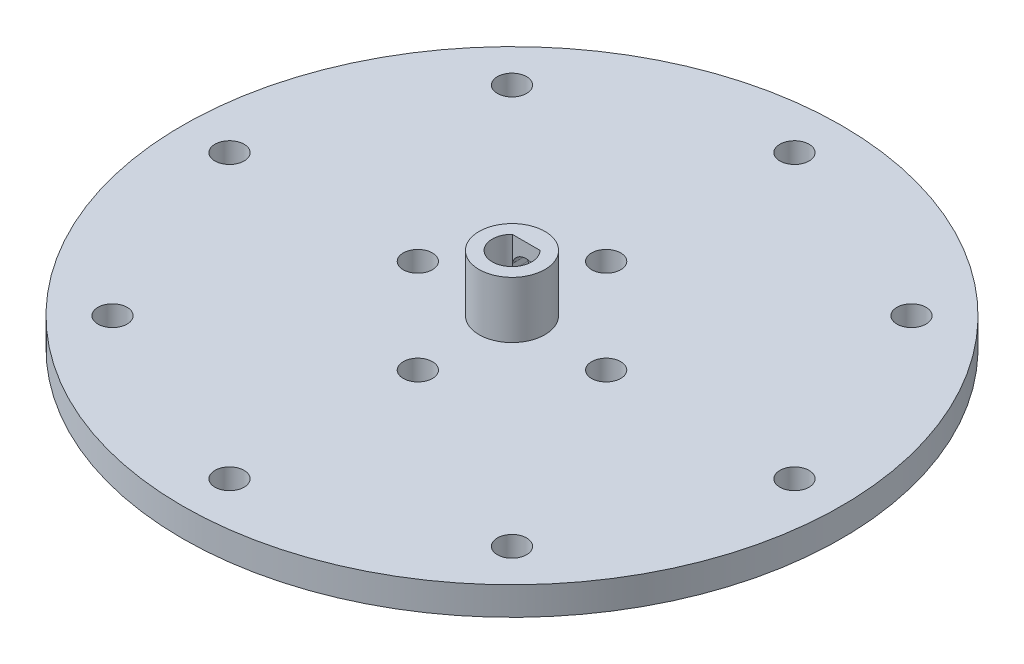
ISO-10303-21;
HEADER;
FILE_DESCRIPTION(('STEP AP214'),'2;1');
FILE_NAME('part.step','',(''),(''),'','','');
FILE_SCHEMA(('AUTOMOTIVE_DESIGN { 1 0 10303 214 1 1 1 1 }'));
ENDSEC;
DATA;
#1=APPLICATION_CONTEXT('core data for automotive mechanical design processes');
#2=APPLICATION_PROTOCOL_DEFINITION('international standard','automotive_design',2000,#1);
#3=PRODUCT_CONTEXT('',#1,'mechanical');
#4=PRODUCT('Part','Part','',(#3));
#5=PRODUCT_RELATED_PRODUCT_CATEGORY('part','',(#4));
#6=PRODUCT_DEFINITION_FORMATION('','',#4);
#7=PRODUCT_DEFINITION_CONTEXT('part definition',#1,'design');
#8=PRODUCT_DEFINITION('design','',#6,#7);
#9=PRODUCT_DEFINITION_SHAPE('','',#8);
#10=(LENGTH_UNIT() NAMED_UNIT(*) SI_UNIT(.MILLI.,.METRE.));
#11=(NAMED_UNIT(*) PLANE_ANGLE_UNIT() SI_UNIT($,.RADIAN.));
#12=(NAMED_UNIT(*) SI_UNIT($,.STERADIAN.) SOLID_ANGLE_UNIT());
#13=UNCERTAINTY_MEASURE_WITH_UNIT(LENGTH_MEASURE(1.E-05),#10,'distance_accuracy_value','');
#14=(GEOMETRIC_REPRESENTATION_CONTEXT(3) GLOBAL_UNCERTAINTY_ASSIGNED_CONTEXT((#13)) GLOBAL_UNIT_ASSIGNED_CONTEXT((#10,
#11,#12)) REPRESENTATION_CONTEXT('',''));
#15=CARTESIAN_POINT('',(0.,0.,0.));
#16=DIRECTION('',(0.,0.,1.));
#17=DIRECTION('',(1.,0.,0.));
#18=AXIS2_PLACEMENT_3D('',#15,#16,#17);
#19=CARTESIAN_POINT('',(0.,0.,-1.5));
#20=DIRECTION('',(0.,0.,1.));
#21=DIRECTION('',(1.,0.,0.));
#22=AXIS2_PLACEMENT_3D('',#19,#20,#21);
#23=PLANE('',#22);
#24=CARTESIAN_POINT('',(0.,6.,-1.5));
#25=DIRECTION('',(0.,0.,1.));
#26=DIRECTION('',(1.,0.,0.));
#27=AXIS2_PLACEMENT_3D('',#24,#25,#26);
#28=CIRCLE('',#27,1.5);
#29=CARTESIAN_POINT('',(-1.46969384566991,5.7,-1.5));
#30=VERTEX_POINT('',#29);
#31=CARTESIAN_POINT('',(1.46969384566991,5.7,-1.5));
#32=VERTEX_POINT('',#31);
#33=EDGE_CURVE('E124',#30,#32,#28,.T.);
#34=ORIENTED_EDGE('',*,*,#33,.F.);
#35=DIRECTION('',(0.,1.,0.));
#36=VECTOR('',#35,1.);
#37=CARTESIAN_POINT('',(-1.46969384566991,0.,-1.5));
#38=LINE('',#37,#36);
#39=CARTESIAN_POINT('',(-1.46969384566991,0.,-1.5));
#40=VERTEX_POINT('',#39);
#41=EDGE_CURVE('E134',#40,#30,#38,.T.);
#42=ORIENTED_EDGE('',*,*,#41,.F.);
#43=DIRECTION('',(1.,0.,0.));
#44=VECTOR('',#43,1.);
#45=CARTESIAN_POINT('',(0.,0.,-1.5));
#46=LINE('',#45,#44);
#47=CARTESIAN_POINT('',(1.46969384566991,0.,-1.5));
#48=VERTEX_POINT('',#47);
#49=EDGE_CURVE('E170',#40,#48,#46,.T.);
#50=ORIENTED_EDGE('',*,*,#49,.T.);
#51=DIRECTION('',(0.,1.,0.));
#52=VECTOR('',#51,1.);
#53=CARTESIAN_POINT('',(1.46969384566991,0.,-1.5));
#54=LINE('',#53,#52);
#55=EDGE_CURVE('E135',#48,#32,#54,.T.);
#56=ORIENTED_EDGE('',*,*,#55,.T.);
#57=EDGE_LOOP('',(#34,#42,#50,#56));
#58=FACE_BOUND('',#57,.T.);
#59=ADVANCED_FACE('F48',(#58),#23,.T.);
#60=CARTESIAN_POINT('',(0.,3.,0.));
#61=DIRECTION('',(0.,-1.,0.));
#62=DIRECTION('',(0.,0.,-1.));
#63=AXIS2_PLACEMENT_3D('',#60,#61,#62);
#64=CYLINDRICAL_SURFACE('',#63,35.);
#65=CARTESIAN_POINT('',(0.,3.,0.));
#66=DIRECTION('',(0.,1.,0.));
#67=DIRECTION('',(0.,0.,1.));
#68=AXIS2_PLACEMENT_3D('',#65,#66,#67);
#69=CIRCLE('',#68,35.);
#70=CARTESIAN_POINT('',(0.,3.,35.));
#71=VERTEX_POINT('',#70);
#72=EDGE_CURVE('E179',#71,#71,#69,.T.);
#73=ORIENTED_EDGE('',*,*,#72,.F.);
#74=EDGE_LOOP('',(#73));
#75=FACE_BOUND('',#74,.T.);
#76=CARTESIAN_POINT('',(0.,0.,0.));
#77=DIRECTION('',(0.,1.,0.));
#78=DIRECTION('',(0.,0.,1.));
#79=AXIS2_PLACEMENT_3D('',#76,#77,#78);
#80=CIRCLE('',#79,35.);
#81=CARTESIAN_POINT('',(0.,0.,35.));
#82=VERTEX_POINT('',#81);
#83=EDGE_CURVE('E175',#82,#82,#80,.T.);
#84=ORIENTED_EDGE('',*,*,#83,.T.);
#85=EDGE_LOOP('',(#84));
#86=FACE_BOUND('',#85,.T.);
#87=ADVANCED_FACE('F50',(#75,#86),#64,.T.);
#88=CARTESIAN_POINT('',(0.,3.,0.));
#89=DIRECTION('',(0.,1.,0.));
#90=DIRECTION('',(0.,0.,1.));
#91=AXIS2_PLACEMENT_3D('',#88,#89,#90);
#92=PLANE('',#91);
#93=CARTESIAN_POINT('',(-2.09488880330588E-13,3.,30.));
#94=DIRECTION('',(0.,1.,0.));
#95=DIRECTION('',(0.,0.,1.));
#96=AXIS2_PLACEMENT_3D('',#93,#94,#95);
#97=CIRCLE('',#96,1.55);
#98=CARTESIAN_POINT('',(-2.09488880330588E-13,3.,31.55));
#99=VERTEX_POINT('',#98);
#100=EDGE_CURVE('E223',#99,#99,#97,.T.);
#101=ORIENTED_EDGE('',*,*,#100,.F.);
#102=EDGE_LOOP('',(#101));
#103=FACE_BOUND('',#102,.T.);
#104=CARTESIAN_POINT('',(-30.,3.,-3.14233320495882E-13));
#105=DIRECTION('',(0.,1.,0.));
#106=DIRECTION('',(0.,0.,1.));
#107=AXIS2_PLACEMENT_3D('',#104,#105,#106);
#108=CIRCLE('',#107,1.55);
#109=CARTESIAN_POINT('',(-30.,3.,1.54999999999969));
#110=VERTEX_POINT('',#109);
#111=EDGE_CURVE('E302',#110,#110,#108,.T.);
#112=ORIENTED_EDGE('',*,*,#111,.F.);
#113=EDGE_LOOP('',(#112));
#114=FACE_BOUND('',#113,.T.);
#115=CARTESIAN_POINT('',(-10.,3.,-1.04744440165294E-13));
#116=DIRECTION('',(0.,1.,0.));
#117=DIRECTION('',(0.,0.,1.));
#118=AXIS2_PLACEMENT_3D('',#115,#116,#117);
#119=CIRCLE('',#118,1.55);
#120=CARTESIAN_POINT('',(-10.,3.,1.5499999999999));
#121=VERTEX_POINT('',#120);
#122=EDGE_CURVE('E306',#121,#121,#119,.T.);
#123=ORIENTED_EDGE('',*,*,#122,.F.);
#124=EDGE_LOOP('',(#123));
#125=FACE_BOUND('',#124,.T.);
#126=CARTESIAN_POINT('',(-21.2132034355962,3.,-21.2132034355967));
#127=DIRECTION('',(0.,1.,0.));
#128=DIRECTION('',(0.,0.,1.));
#129=AXIS2_PLACEMENT_3D('',#126,#127,#128);
#130=CIRCLE('',#129,1.55);
#131=CARTESIAN_POINT('',(-21.2132034355962,3.,-19.6632034355967));
#132=VERTEX_POINT('',#131);
#133=EDGE_CURVE('E298',#132,#132,#130,.T.);
#134=ORIENTED_EDGE('',*,*,#133,.F.);
#135=EDGE_LOOP('',(#134));
#136=FACE_BOUND('',#135,.T.);
#137=CARTESIAN_POINT('',(0.,3.,10.));
#138=DIRECTION('',(0.,1.,0.));
#139=DIRECTION('',(0.,0.,1.));
#140=AXIS2_PLACEMENT_3D('',#137,#138,#139);
#141=CIRCLE('',#140,1.55);
#142=CARTESIAN_POINT('',(0.,3.,11.55));
#143=VERTEX_POINT('',#142);
#144=EDGE_CURVE('E282',#143,#143,#141,.T.);
#145=ORIENTED_EDGE('',*,*,#144,.F.);
#146=EDGE_LOOP('',(#145));
#147=FACE_BOUND('',#146,.T.);
#148=CARTESIAN_POINT('',(21.2132034355963,3.,21.2132034355965));
#149=DIRECTION('',(0.,1.,0.));
#150=DIRECTION('',(0.,0.,1.));
#151=AXIS2_PLACEMENT_3D('',#148,#149,#150);
#152=CIRCLE('',#151,1.55);
#153=CARTESIAN_POINT('',(21.2132034355963,3.,22.7632034355965));
#154=VERTEX_POINT('',#153);
#155=EDGE_CURVE('E278',#154,#154,#152,.T.);
#156=ORIENTED_EDGE('',*,*,#155,.F.);
#157=EDGE_LOOP('',(#156));
#158=FACE_BOUND('',#157,.T.);
#159=CARTESIAN_POINT('',(30.,3.,1.04744440165294E-13));
#160=DIRECTION('',(0.,1.,0.));
#161=DIRECTION('',(0.,0.,1.));
#162=AXIS2_PLACEMENT_3D('',#159,#160,#161);
#163=CIRCLE('',#162,1.55);
#164=CARTESIAN_POINT('',(30.,3.,1.5500000000001));
#165=VERTEX_POINT('',#164);
#166=EDGE_CURVE('E273',#165,#165,#163,.T.);
#167=ORIENTED_EDGE('',*,*,#166,.F.);
#168=EDGE_LOOP('',(#167));
#169=FACE_BOUND('',#168,.T.);
#170=CARTESIAN_POINT('',(21.2132034355965,3.,-21.2132034355964));
#171=DIRECTION('',(0.,1.,0.));
#172=DIRECTION('',(0.,0.,1.));
#173=AXIS2_PLACEMENT_3D('',#170,#171,#172);
#174=CIRCLE('',#173,1.55);
#175=CARTESIAN_POINT('',(21.2132034355965,3.,-19.6632034355964));
#176=VERTEX_POINT('',#175);
#177=EDGE_CURVE('E269',#176,#176,#174,.T.);
#178=ORIENTED_EDGE('',*,*,#177,.F.);
#179=EDGE_LOOP('',(#178));
#180=FACE_BOUND('',#179,.T.);
#181=CARTESIAN_POINT('',(-21.2132034355966,3.,21.2132034355962));
#182=DIRECTION('',(0.,1.,0.));
#183=DIRECTION('',(0.,0.,1.));
#184=AXIS2_PLACEMENT_3D('',#181,#182,#183);
#185=CIRCLE('',#184,1.55);
#186=CARTESIAN_POINT('',(-21.2132034355966,3.,22.7632034355962));
#187=VERTEX_POINT('',#186);
#188=EDGE_CURVE('E294',#187,#187,#185,.T.);
#189=ORIENTED_EDGE('',*,*,#188,.F.);
#190=EDGE_LOOP('',(#189));
#191=FACE_BOUND('',#190,.T.);
#192=CARTESIAN_POINT('',(0.,3.,-10.));
#193=DIRECTION('',(0.,1.,0.));
#194=DIRECTION('',(0.,0.,1.));
#195=AXIS2_PLACEMENT_3D('',#192,#193,#194);
#196=CIRCLE('',#195,1.55);
#197=CARTESIAN_POINT('',(0.,3.,-8.45));
#198=VERTEX_POINT('',#197);
#199=EDGE_CURVE('E290',#198,#198,#196,.T.);
#200=ORIENTED_EDGE('',*,*,#199,.F.);
#201=EDGE_LOOP('',(#200));
#202=FACE_BOUND('',#201,.T.);
#203=CARTESIAN_POINT('',(10.,3.,0.));
#204=DIRECTION('',(0.,1.,0.));
#205=DIRECTION('',(0.,0.,1.));
#206=AXIS2_PLACEMENT_3D('',#203,#204,#205);
#207=CIRCLE('',#206,1.55);
#208=CARTESIAN_POINT('',(10.,3.,1.55000000000004));
#209=VERTEX_POINT('',#208);
#210=EDGE_CURVE('E286',#209,#209,#207,.T.);
#211=ORIENTED_EDGE('',*,*,#210,.F.);
#212=EDGE_LOOP('',(#211));
#213=FACE_BOUND('',#212,.T.);
#214=CARTESIAN_POINT('',(0.,3.,-30.));
#215=DIRECTION('',(0.,1.,0.));
#216=DIRECTION('',(0.,0.,1.));
#217=AXIS2_PLACEMENT_3D('',#214,#215,#216);
#218=CIRCLE('',#217,1.55);
#219=CARTESIAN_POINT('',(0.,3.,-28.45));
#220=VERTEX_POINT('',#219);
#221=EDGE_CURVE('E274',#220,#220,#218,.T.);
#222=ORIENTED_EDGE('',*,*,#221,.F.);
#223=EDGE_LOOP('',(#222));
#224=FACE_BOUND('',#223,.T.);
#225=CARTESIAN_POINT('',(0.,3.,0.));
#226=DIRECTION('',(0.,1.,0.));
#227=DIRECTION('',(0.,0.,1.));
#228=AXIS2_PLACEMENT_3D('',#225,#226,#227);
#229=CIRCLE('',#228,3.5);
#230=CARTESIAN_POINT('',(0.,3.,3.5));
#231=VERTEX_POINT('',#230);
#232=EDGE_CURVE('E149',#231,#231,#229,.T.);
#233=ORIENTED_EDGE('',*,*,#232,.F.);
#234=EDGE_LOOP('',(#233));
#235=FACE_BOUND('',#234,.T.);
#236=ORIENTED_EDGE('',*,*,#72,.T.);
#237=EDGE_LOOP('',(#236));
#238=FACE_BOUND('',#237,.T.);
#239=ADVANCED_FACE('F320',(#103,#114,#125,#136,#147,#158,#169,#180,#191,#202,#213,#224,#235,
#238),#92,.T.);
#240=CARTESIAN_POINT('',(0.,0.,0.));
#241=DIRECTION('',(0.,1.,0.));
#242=DIRECTION('',(0.,0.,1.));
#243=AXIS2_PLACEMENT_3D('',#240,#241,#242);
#244=PLANE('',#243);
#245=CARTESIAN_POINT('',(-2.09488880330588E-13,0.,30.));
#246=DIRECTION('',(0.,1.,0.));
#247=DIRECTION('',(0.,0.,1.));
#248=AXIS2_PLACEMENT_3D('',#245,#246,#247);
#249=CIRCLE('',#248,1.55);
#250=CARTESIAN_POINT('',(-2.09488880330588E-13,0.,31.55));
#251=VERTEX_POINT('',#250);
#252=EDGE_CURVE('E52',#251,#251,#249,.T.);
#253=ORIENTED_EDGE('',*,*,#252,.T.);
#254=EDGE_LOOP('',(#253));
#255=FACE_BOUND('',#254,.T.);
#256=CARTESIAN_POINT('',(-30.,0.,-3.14233320495882E-13));
#257=DIRECTION('',(0.,1.,0.));
#258=DIRECTION('',(0.,0.,1.));
#259=AXIS2_PLACEMENT_3D('',#256,#257,#258);
#260=CIRCLE('',#259,1.55);
#261=CARTESIAN_POINT('',(-30.,0.,1.54999999999969));
#262=VERTEX_POINT('',#261);
#263=EDGE_CURVE('E258',#262,#262,#260,.T.);
#264=ORIENTED_EDGE('',*,*,#263,.T.);
#265=EDGE_LOOP('',(#264));
#266=FACE_BOUND('',#265,.T.);
#267=CARTESIAN_POINT('',(-10.,0.,-1.04744440165294E-13));
#268=DIRECTION('',(0.,1.,0.));
#269=DIRECTION('',(0.,0.,1.));
#270=AXIS2_PLACEMENT_3D('',#267,#268,#269);
#271=CIRCLE('',#270,1.55);
#272=CARTESIAN_POINT('',(-10.,0.,1.5499999999999));
#273=VERTEX_POINT('',#272);
#274=EDGE_CURVE('E255',#273,#273,#271,.T.);
#275=ORIENTED_EDGE('',*,*,#274,.T.);
#276=EDGE_LOOP('',(#275));
#277=FACE_BOUND('',#276,.T.);
#278=CARTESIAN_POINT('',(-21.2132034355962,0.,-21.2132034355967));
#279=DIRECTION('',(0.,1.,0.));
#280=DIRECTION('',(0.,0.,1.));
#281=AXIS2_PLACEMENT_3D('',#278,#279,#280);
#282=CIRCLE('',#281,1.55);
#283=CARTESIAN_POINT('',(-21.2132034355962,0.,-19.6632034355967));
#284=VERTEX_POINT('',#283);
#285=EDGE_CURVE('E251',#284,#284,#282,.T.);
#286=ORIENTED_EDGE('',*,*,#285,.T.);
#287=EDGE_LOOP('',(#286));
#288=FACE_BOUND('',#287,.T.);
#289=CARTESIAN_POINT('',(0.,0.,10.));
#290=DIRECTION('',(0.,1.,0.));
#291=DIRECTION('',(0.,0.,1.));
#292=AXIS2_PLACEMENT_3D('',#289,#290,#291);
#293=CIRCLE('',#292,1.55);
#294=CARTESIAN_POINT('',(0.,0.,11.55));
#295=VERTEX_POINT('',#294);
#296=EDGE_CURVE('E247',#295,#295,#293,.T.);
#297=ORIENTED_EDGE('',*,*,#296,.T.);
#298=EDGE_LOOP('',(#297));
#299=FACE_BOUND('',#298,.T.);
#300=CARTESIAN_POINT('',(21.2132034355963,0.,21.2132034355965));
#301=DIRECTION('',(0.,1.,0.));
#302=DIRECTION('',(0.,0.,1.));
#303=AXIS2_PLACEMENT_3D('',#300,#301,#302);
#304=CIRCLE('',#303,1.55);
#305=CARTESIAN_POINT('',(21.2132034355963,0.,22.7632034355965));
#306=VERTEX_POINT('',#305);
#307=EDGE_CURVE('E243',#306,#306,#304,.T.);
#308=ORIENTED_EDGE('',*,*,#307,.T.);
#309=EDGE_LOOP('',(#308));
#310=FACE_BOUND('',#309,.T.);
#311=CARTESIAN_POINT('',(30.,0.,1.04744440165294E-13));
#312=DIRECTION('',(0.,1.,0.));
#313=DIRECTION('',(0.,0.,1.));
#314=AXIS2_PLACEMENT_3D('',#311,#312,#313);
#315=CIRCLE('',#314,1.55);
#316=CARTESIAN_POINT('',(30.,0.,1.5500000000001));
#317=VERTEX_POINT('',#316);
#318=EDGE_CURVE('E239',#317,#317,#315,.T.);
#319=ORIENTED_EDGE('',*,*,#318,.T.);
#320=EDGE_LOOP('',(#319));
#321=FACE_BOUND('',#320,.T.);
#322=CARTESIAN_POINT('',(21.2132034355965,0.,-21.2132034355964));
#323=DIRECTION('',(0.,1.,0.));
#324=DIRECTION('',(0.,0.,1.));
#325=AXIS2_PLACEMENT_3D('',#322,#323,#324);
#326=CIRCLE('',#325,1.55);
#327=CARTESIAN_POINT('',(21.2132034355965,0.,-19.6632034355964));
#328=VERTEX_POINT('',#327);
#329=EDGE_CURVE('E235',#328,#328,#326,.T.);
#330=ORIENTED_EDGE('',*,*,#329,.T.);
#331=EDGE_LOOP('',(#330));
#332=FACE_BOUND('',#331,.T.);
#333=CARTESIAN_POINT('',(-21.2132034355966,0.,21.2132034355962));
#334=DIRECTION('',(0.,1.,0.));
#335=DIRECTION('',(0.,0.,1.));
#336=AXIS2_PLACEMENT_3D('',#333,#334,#335);
#337=CIRCLE('',#336,1.55);
#338=CARTESIAN_POINT('',(-21.2132034355966,0.,22.7632034355962));
#339=VERTEX_POINT('',#338);
#340=EDGE_CURVE('E231',#339,#339,#337,.T.);
#341=ORIENTED_EDGE('',*,*,#340,.T.);
#342=EDGE_LOOP('',(#341));
#343=FACE_BOUND('',#342,.T.);
#344=CARTESIAN_POINT('',(0.,0.,-10.));
#345=DIRECTION('',(0.,1.,0.));
#346=DIRECTION('',(0.,0.,1.));
#347=AXIS2_PLACEMENT_3D('',#344,#345,#346);
#348=CIRCLE('',#347,1.55);
#349=CARTESIAN_POINT('',(0.,0.,-8.45));
#350=VERTEX_POINT('',#349);
#351=EDGE_CURVE('E227',#350,#350,#348,.T.);
#352=ORIENTED_EDGE('',*,*,#351,.T.);
#353=EDGE_LOOP('',(#352));
#354=FACE_BOUND('',#353,.T.);
#355=CARTESIAN_POINT('',(10.,0.,0.));
#356=DIRECTION('',(0.,1.,0.));
#357=DIRECTION('',(0.,0.,1.));
#358=AXIS2_PLACEMENT_3D('',#355,#356,#357);
#359=CIRCLE('',#358,1.55);
#360=CARTESIAN_POINT('',(10.,0.,1.55000000000004));
#361=VERTEX_POINT('',#360);
#362=EDGE_CURVE('E222',#361,#361,#359,.T.);
#363=ORIENTED_EDGE('',*,*,#362,.T.);
#364=EDGE_LOOP('',(#363));
#365=FACE_BOUND('',#364,.T.);
#366=CARTESIAN_POINT('',(0.,0.,-30.));
#367=DIRECTION('',(0.,1.,0.));
#368=DIRECTION('',(0.,0.,1.));
#369=AXIS2_PLACEMENT_3D('',#366,#367,#368);
#370=CIRCLE('',#369,1.55);
#371=CARTESIAN_POINT('',(0.,0.,-28.45));
#372=VERTEX_POINT('',#371);
#373=EDGE_CURVE('E218',#372,#372,#370,.T.);
#374=ORIENTED_EDGE('',*,*,#373,.T.);
#375=EDGE_LOOP('',(#374));
#376=FACE_BOUND('',#375,.T.);
#377=ORIENTED_EDGE('',*,*,#49,.F.);
#378=CARTESIAN_POINT('',(0.,0.,0.));
#379=DIRECTION('',(0.,1.,0.));
#380=DIRECTION('',(0.,0.,1.));
#381=AXIS2_PLACEMENT_3D('',#378,#379,#380);
#382=CIRCLE('',#381,2.1);
#383=EDGE_CURVE('E163',#40,#48,#382,.T.);
#384=ORIENTED_EDGE('',*,*,#383,.T.);
#385=EDGE_LOOP('',(#377,#384));
#386=FACE_BOUND('',#385,.T.);
#387=ORIENTED_EDGE('',*,*,#83,.F.);
#388=EDGE_LOOP('',(#387));
#389=FACE_BOUND('',#388,.T.);
#390=ADVANCED_FACE('F323',(#255,#266,#277,#288,#299,#310,#321,#332,#343,#354,#365,#376,#386,
#389),#244,.F.);
#391=CARTESIAN_POINT('',(0.,0.,0.));
#392=DIRECTION('',(0.,1.,0.));
#393=DIRECTION('',(0.,0.,1.));
#394=AXIS2_PLACEMENT_3D('',#391,#392,#393);
#395=CYLINDRICAL_SURFACE('',#394,2.1);
#396=ORIENTED_EDGE('',*,*,#41,.T.);
#397=DIRECTION('',(0.,-1.,0.));
#398=VECTOR('',#397,1.);
#399=CARTESIAN_POINT('',(-1.46969384566991,0.,-1.5));
#400=LINE('',#399,#398);
#401=CARTESIAN_POINT('',(-1.46969384566991,6.3,-1.5));
#402=VERTEX_POINT('',#401);
#403=EDGE_CURVE('E107',#402,#30,#400,.T.);
#404=ORIENTED_EDGE('',*,*,#403,.F.);
#405=CARTESIAN_POINT('',(-1.46969384566991,9.,-1.5));
#406=VERTEX_POINT('',#405);
#407=EDGE_CURVE('E126',#402,#406,#38,.T.);
#408=ORIENTED_EDGE('',*,*,#407,.T.);
#409=CARTESIAN_POINT('',(0.,9.,0.));
#410=DIRECTION('',(0.,1.,0.));
#411=DIRECTION('',(0.,0.,1.));
#412=AXIS2_PLACEMENT_3D('',#409,#410,#411);
#413=CIRCLE('',#412,2.1);
#414=CARTESIAN_POINT('',(1.46969384566991,9.,-1.5));
#415=VERTEX_POINT('',#414);
#416=EDGE_CURVE('E154',#415,#406,#413,.F.);
#417=ORIENTED_EDGE('',*,*,#416,.F.);
#418=CARTESIAN_POINT('',(1.46969384566991,6.3,-1.5));
#419=VERTEX_POINT('',#418);
#420=EDGE_CURVE('E172',#419,#415,#54,.T.);
#421=ORIENTED_EDGE('',*,*,#420,.F.);
#422=DIRECTION('',(0.,1.,0.));
#423=VECTOR('',#422,1.);
#424=CARTESIAN_POINT('',(1.46969384566991,0.,-1.5));
#425=LINE('',#424,#423);
#426=EDGE_CURVE('E66',#32,#419,#425,.T.);
#427=ORIENTED_EDGE('',*,*,#426,.F.);
#428=ORIENTED_EDGE('',*,*,#55,.F.);
#429=ORIENTED_EDGE('',*,*,#383,.F.);
#430=EDGE_LOOP('',(#396,#404,#408,#417,#421,#427,#428,#429));
#431=FACE_BOUND('',#430,.T.);
#432=ADVANCED_FACE('F138',(#431),#395,.F.);
#433=EDGE_CURVE('E117',#419,#402,#28,.T.);
#434=ORIENTED_EDGE('',*,*,#433,.F.);
#435=ORIENTED_EDGE('',*,*,#420,.T.);
#436=DIRECTION('',(1.,0.,0.));
#437=VECTOR('',#436,1.);
#438=CARTESIAN_POINT('',(0.,9.,-1.5));
#439=LINE('',#438,#437);
#440=EDGE_CURVE('E129',#406,#415,#439,.T.);
#441=ORIENTED_EDGE('',*,*,#440,.F.);
#442=ORIENTED_EDGE('',*,*,#407,.F.);
#443=EDGE_LOOP('',(#434,#435,#441,#442));
#444=FACE_BOUND('',#443,.T.);
#445=ADVANCED_FACE('F127',(#444),#23,.T.);
#446=CARTESIAN_POINT('',(0.,9.,0.));
#447=DIRECTION('',(0.,-1.,0.));
#448=DIRECTION('',(0.,0.,-1.));
#449=AXIS2_PLACEMENT_3D('',#446,#447,#448);
#450=CYLINDRICAL_SURFACE('',#449,3.5);
#451=CARTESIAN_POINT('',(-1.46969384566991,5.7,-3.17647603485372));
#452=CARTESIAN_POINT('',(-1.46130020607163,5.65887448835335,-3.18035518207456));
#453=CARTESIAN_POINT('',(-1.45119735355134,5.61819841659546,-3.18499387564641));
#454=CARTESIAN_POINT('',(-1.4276949527078,5.53801304992319,-3.1956000689246));
#455=CARTESIAN_POINT('',(-1.41429735927973,5.49850307863026,-3.20156678046871));
#456=CARTESIAN_POINT('',(-1.36944600927843,5.38235993314439,-3.2211302576785));
#457=CARTESIAN_POINT('',(-1.33326504253588,5.30778288742949,-3.23642420650485));
#458=CARTESIAN_POINT('',(-1.24961036319028,5.16619135576489,-3.26963102507058));
#459=CARTESIAN_POINT('',(-1.20215760737209,5.09916317170623,-3.28753901118928));
#460=CARTESIAN_POINT('',(-1.09705351173755,4.97375918841512,-3.32408924762823));
#461=CARTESIAN_POINT('',(-1.03939221664782,4.91539193831289,-3.34273220075991));
#462=CARTESIAN_POINT('',(-0.911940601572353,4.80594232878065,-3.37979042377527));
#463=CARTESIAN_POINT('',(-0.841681878039903,4.75538288903244,-3.39814565951191));
#464=CARTESIAN_POINT('',(-0.692935424454447,4.66683710859213,-3.43156515011324));
#465=CARTESIAN_POINT('',(-0.614450814912467,4.6288460226324,-3.44663064630952));
#466=CARTESIAN_POINT('',(-0.453719202954011,4.5677597219708,-3.47139066111713));
#467=CARTESIAN_POINT('',(-0.371646956021259,4.54426502653931,-3.48122807345904));
#468=CARTESIAN_POINT('',(-0.204240587271809,4.5115281960065,-3.4950426750209));
#469=CARTESIAN_POINT('',(-0.11890828821514,4.50227821254441,-3.49902309119639));
#470=CARTESIAN_POINT('',(0.0457498504618776,4.49860734085987,-3.50059737735718));
#471=CARTESIAN_POINT('',(0.125049927826331,4.50313377146361,-3.49864463111452));
#472=CARTESIAN_POINT('',(0.28164327874313,4.52456061910681,-3.48953114200984));
#473=CARTESIAN_POINT('',(0.358936611047429,4.54146067345678,-3.4823705517976));
#474=CARTESIAN_POINT('',(0.508553935090963,4.58670005070565,-3.46366865760427));
#475=CARTESIAN_POINT('',(0.580923807647377,4.61490942609595,-3.45217720354554));
#476=CARTESIAN_POINT('',(0.719971867620834,4.68182025008345,-3.42587996733639));
#477=CARTESIAN_POINT('',(0.786648945915085,4.72052373713479,-3.41107354135869));
#478=CARTESIAN_POINT('',(0.91705797383751,4.81018340933296,-3.37843310316845));
#479=CARTESIAN_POINT('',(0.980324349848856,4.86176775590071,-3.3604655829142));
#480=CARTESIAN_POINT('',(1.09765791922006,4.97444165867865,-3.32399323724172));
#481=CARTESIAN_POINT('',(1.15171632316654,5.03554019130992,-3.30548791797225));
#482=CARTESIAN_POINT('',(1.2523262040022,5.16985572314183,-3.26874888660277));
#483=CARTESIAN_POINT('',(1.29823296643051,5.24357976905927,-3.25059803462502));
#484=CARTESIAN_POINT('',(1.37680995653971,5.39842703199199,-3.21810703604407));
#485=CARTESIAN_POINT('',(1.40951391550679,5.47953073626497,-3.20375721106557));
#486=CARTESIAN_POINT('',(1.44181406360197,5.58559801701112,-3.18923589887226));
#487=CARTESIAN_POINT('',(1.44813867585153,5.60827140675019,-3.18636694042264));
#488=CARTESIAN_POINT('',(1.45971835820539,5.65391596513604,-3.18107897409152));
#489=CARTESIAN_POINT('',(1.4649745335478,5.67688679964921,-3.17865950146748));
#490=CARTESIAN_POINT('',(1.46969384566991,5.7,-3.17647603485372));
#491=B_SPLINE_CURVE_WITH_KNOTS('',3,(#451,#452,#453,#454,#455,#456,#457,#458,#459,#460,#461,
#462,#463,#464,#465,#466,#467,#468,#469,#470,#471,#472,#473,#474,#475,#476,#477,#478,#479,#480,
#481,#482,#483,#484,#485,#486,#487,#488,#489,#490),.UNSPECIFIED.,.F.,.F.,(4,2,2,2,2,2,2,2,2,2,2,
2,2,2,2,2,2,2,2,4),(0.,0.126361786393148,0.252648777661876,0.504218601243253,0.755324311353071,
1.0066762599803,1.27083912626174,1.5349021419233,1.79131875120376,2.04759403288244,
2.28479103221719,2.52198107922982,2.75652046337304,2.99110543886625,3.24078493937343,
3.49070145032882,3.7556073898977,4.01983218292104,4.09095113601546,4.16199614189348),.UNSPECIFIED.);
#492=CARTESIAN_POINT('',(-1.46969384566991,5.7,-3.17647603485372));
#493=VERTEX_POINT('',#492);
#494=CARTESIAN_POINT('',(1.46969384566991,5.7,-3.17647603485372));
#495=VERTEX_POINT('',#494);
#496=EDGE_CURVE('E58',#493,#495,#491,.T.);
#497=ORIENTED_EDGE('',*,*,#496,.T.);
#498=DIRECTION('',(0.,-1.,0.));
#499=VECTOR('',#498,1.);
#500=CARTESIAN_POINT('',(1.46969384566991,9.,-3.17647603485372));
#501=LINE('',#500,#499);
#502=CARTESIAN_POINT('',(1.46969384566991,6.3,-3.17647603485372));
#503=VERTEX_POINT('',#502);
#504=EDGE_CURVE('E12',#495,#503,#501,.F.);
#505=ORIENTED_EDGE('',*,*,#504,.T.);
#506=CARTESIAN_POINT('',(1.46969384566991,6.3,-3.17647603485372));
#507=CARTESIAN_POINT('',(1.46130020607163,6.34112551164666,-3.18035518207456));
#508=CARTESIAN_POINT('',(1.45119735355134,6.38180158340455,-3.18499387564641));
#509=CARTESIAN_POINT('',(1.4276949527078,6.46198695007682,-3.1956000689246));
#510=CARTESIAN_POINT('',(1.41429735927973,6.50149692136975,-3.20156678046871));
#511=CARTESIAN_POINT('',(1.36944600927843,6.61764006685561,-3.2211302576785));
#512=CARTESIAN_POINT('',(1.33326504253587,6.69221711257052,-3.23642420650485));
#513=CARTESIAN_POINT('',(1.24961036319028,6.83380864423512,-3.26963102507058));
#514=CARTESIAN_POINT('',(1.20215760737208,6.90083682829378,-3.28753901118928));
#515=CARTESIAN_POINT('',(1.09705351173755,7.02624081158489,-3.32408924762823));
#516=CARTESIAN_POINT('',(1.03939221664782,7.08460806168711,-3.34273220075991));
#517=CARTESIAN_POINT('',(0.91194060157235,7.19405767121935,-3.37979042377527));
#518=CARTESIAN_POINT('',(0.841681878039899,7.24461711096757,-3.39814565951191));
#519=CARTESIAN_POINT('',(0.692935424454444,7.33316289140788,-3.43156515011324));
#520=CARTESIAN_POINT('',(0.614450814912463,7.3711539773676,-3.44663064630952));
#521=CARTESIAN_POINT('',(0.453719202954007,7.43224027802921,-3.47139066111713));
#522=CARTESIAN_POINT('',(0.371646956021255,7.45573497346069,-3.48122807345904));
#523=CARTESIAN_POINT('',(0.204240587271805,7.4884718039935,-3.4950426750209));
#524=CARTESIAN_POINT('',(0.118908288215136,7.49772178745559,-3.49902309119639));
#525=CARTESIAN_POINT('',(-0.0457498504618817,7.50139265914013,-3.50059737735718));
#526=CARTESIAN_POINT('',(-0.125049927826335,7.49686622853639,-3.49864463111452));
#527=CARTESIAN_POINT('',(-0.281643278743134,7.47543938089319,-3.48953114200984));
#528=CARTESIAN_POINT('',(-0.358936611047433,7.45853932654322,-3.4823705517976));
#529=CARTESIAN_POINT('',(-0.508553935090967,7.41329994929435,-3.46366865760427));
#530=CARTESIAN_POINT('',(-0.580923807647381,7.38509057390405,-3.45217720354554));
#531=CARTESIAN_POINT('',(-0.719971867620838,7.31817974991655,-3.42587996733639));
#532=CARTESIAN_POINT('',(-0.786648945915088,7.27947626286521,-3.41107354135869));
#533=CARTESIAN_POINT('',(-0.917057973837513,7.18981659066704,-3.37843310316845));
#534=CARTESIAN_POINT('',(-0.980324349848859,7.13823224409929,-3.3604655829142));
#535=CARTESIAN_POINT('',(-1.09765791922006,7.02555834132135,-3.32399323724172));
#536=CARTESIAN_POINT('',(-1.15171632316654,6.96445980869008,-3.30548791797225));
#537=CARTESIAN_POINT('',(-1.25232620400221,6.83014427685816,-3.26874888660277));
#538=CARTESIAN_POINT('',(-1.29823296643051,6.75642023094073,-3.25059803462502));
#539=CARTESIAN_POINT('',(-1.37680995653971,6.601572968008,-3.21810703604407));
#540=CARTESIAN_POINT('',(-1.40951391550679,6.52046926373503,-3.20375721106557));
#541=CARTESIAN_POINT('',(-1.44181406360197,6.41440198298888,-3.18923589887226));
#542=CARTESIAN_POINT('',(-1.44813867585153,6.3917285932498,-3.18636694042264));
#543=CARTESIAN_POINT('',(-1.45971835820539,6.34608403486395,-3.18107897409152));
#544=CARTESIAN_POINT('',(-1.4649745335478,6.32311320035078,-3.17865950146748));
#545=CARTESIAN_POINT('',(-1.46969384566991,6.3,-3.17647603485372));
#546=B_SPLINE_CURVE_WITH_KNOTS('',3,(#506,#507,#508,#509,#510,#511,#512,#513,#514,#515,#516,
#517,#518,#519,#520,#521,#522,#523,#524,#525,#526,#527,#528,#529,#530,#531,#532,#533,#534,#535,
#536,#537,#538,#539,#540,#541,#542,#543,#544,#545),.UNSPECIFIED.,.F.,.F.,(4,2,2,2,2,2,2,2,2,2,2,
2,2,2,2,2,2,2,2,4),(0.,0.126361786393148,0.252648777661876,0.504218601243253,0.755324311353072,
1.0066762599803,1.27083912626174,1.5349021419233,1.79131875120376,2.04759403288244,
2.28479103221719,2.52198107922983,2.75652046337304,2.99110543886625,3.24078493937343,
3.49070145032882,3.7556073898977,4.01983218292104,4.09095113601546,4.16199614189348),.UNSPECIFIED.);
#547=CARTESIAN_POINT('',(-1.46969384566991,6.3,-3.17647603485372));
#548=VERTEX_POINT('',#547);
#549=EDGE_CURVE('E183',#503,#548,#546,.T.);
#550=ORIENTED_EDGE('',*,*,#549,.T.);
#551=DIRECTION('',(0.,-1.,0.));
#552=VECTOR('',#551,1.);
#553=CARTESIAN_POINT('',(-1.46969384566991,9.,-3.17647603485372));
#554=LINE('',#553,#552);
#555=EDGE_CURVE('E110',#548,#493,#554,.T.);
#556=ORIENTED_EDGE('',*,*,#555,.T.);
#557=EDGE_LOOP('',(#497,#505,#550,#556));
#558=FACE_BOUND('',#557,.T.);
#559=CARTESIAN_POINT('',(0.,9.,0.));
#560=DIRECTION('',(0.,1.,0.));
#561=DIRECTION('',(0.,0.,1.));
#562=AXIS2_PLACEMENT_3D('',#559,#560,#561);
#563=CIRCLE('',#562,3.5);
#564=CARTESIAN_POINT('',(0.,9.,3.5));
#565=VERTEX_POINT('',#564);
#566=EDGE_CURVE('E159',#565,#565,#563,.T.);
#567=ORIENTED_EDGE('',*,*,#566,.F.);
#568=EDGE_LOOP('',(#567));
#569=FACE_BOUND('',#568,.T.);
#570=ORIENTED_EDGE('',*,*,#232,.T.);
#571=EDGE_LOOP('',(#570));
#572=FACE_BOUND('',#571,.T.);
#573=ADVANCED_FACE('F196',(#558,#569,#572),#450,.T.);
#574=CARTESIAN_POINT('',(0.,9.,0.));
#575=DIRECTION('',(0.,1.,0.));
#576=DIRECTION('',(0.,0.,1.));
#577=AXIS2_PLACEMENT_3D('',#574,#575,#576);
#578=PLANE('',#577);
#579=ORIENTED_EDGE('',*,*,#416,.T.);
#580=ORIENTED_EDGE('',*,*,#440,.T.);
#581=EDGE_LOOP('',(#579,#580));
#582=FACE_BOUND('',#581,.T.);
#583=ORIENTED_EDGE('',*,*,#566,.T.);
#584=EDGE_LOOP('',(#583));
#585=FACE_BOUND('',#584,.T.);
#586=ADVANCED_FACE('F370',(#582,#585),#578,.T.);
#587=CARTESIAN_POINT('',(1.46969384566991,0.,-7.5));
#588=DIRECTION('',(1.,0.,0.));
#589=DIRECTION('',(0.,0.,-1.));
#590=AXIS2_PLACEMENT_3D('',#587,#588,#589);
#591=PLANE('',#590);
#592=DIRECTION('',(0.,0.,1.));
#593=VECTOR('',#592,1.);
#594=CARTESIAN_POINT('',(1.46969384566991,5.7,-7.5));
#595=LINE('',#594,#593);
#596=EDGE_CURVE('E146',#495,#32,#595,.T.);
#597=ORIENTED_EDGE('',*,*,#596,.T.);
#598=ORIENTED_EDGE('',*,*,#426,.T.);
#599=DIRECTION('',(0.,0.,1.));
#600=VECTOR('',#599,1.);
#601=CARTESIAN_POINT('',(1.46969384566991,6.3,-7.5));
#602=LINE('',#601,#600);
#603=EDGE_CURVE('E114',#503,#419,#602,.T.);
#604=ORIENTED_EDGE('',*,*,#603,.F.);
#605=ORIENTED_EDGE('',*,*,#504,.F.);
#606=EDGE_LOOP('',(#597,#598,#604,#605));
#607=FACE_BOUND('',#606,.T.);
#608=ADVANCED_FACE('F205',(#607),#591,.F.);
#609=CARTESIAN_POINT('',(0.,6.,-7.5));
#610=DIRECTION('',(0.,0.,1.));
#611=DIRECTION('',(1.,0.,0.));
#612=AXIS2_PLACEMENT_3D('',#609,#610,#611);
#613=CYLINDRICAL_SURFACE('',#612,1.5);
#614=DIRECTION('',(0.,0.,1.));
#615=VECTOR('',#614,1.);
#616=CARTESIAN_POINT('',(-1.46969384566991,5.7,-7.5));
#617=LINE('',#616,#615);
#618=EDGE_CURVE('E113',#493,#30,#617,.T.);
#619=ORIENTED_EDGE('',*,*,#618,.T.);
#620=ORIENTED_EDGE('',*,*,#33,.T.);
#621=ORIENTED_EDGE('',*,*,#596,.F.);
#622=ORIENTED_EDGE('',*,*,#496,.F.);
#623=EDGE_LOOP('',(#619,#620,#621,#622));
#624=FACE_BOUND('',#623,.T.);
#625=ADVANCED_FACE('F200',(#624),#613,.F.);
#626=CARTESIAN_POINT('',(-1.46969384566991,0.,-7.5));
#627=DIRECTION('',(-1.,0.,0.));
#628=DIRECTION('',(0.,0.,1.));
#629=AXIS2_PLACEMENT_3D('',#626,#627,#628);
#630=PLANE('',#629);
#631=DIRECTION('',(0.,0.,1.));
#632=VECTOR('',#631,1.);
#633=CARTESIAN_POINT('',(-1.46969384566991,6.3,-7.5));
#634=LINE('',#633,#632);
#635=EDGE_CURVE('E74',#548,#402,#634,.T.);
#636=ORIENTED_EDGE('',*,*,#635,.T.);
#637=ORIENTED_EDGE('',*,*,#403,.T.);
#638=ORIENTED_EDGE('',*,*,#618,.F.);
#639=ORIENTED_EDGE('',*,*,#555,.F.);
#640=EDGE_LOOP('',(#636,#637,#638,#639));
#641=FACE_BOUND('',#640,.T.);
#642=ADVANCED_FACE('F104',(#641),#630,.F.);
#643=ORIENTED_EDGE('',*,*,#603,.T.);
#644=ORIENTED_EDGE('',*,*,#433,.T.);
#645=ORIENTED_EDGE('',*,*,#635,.F.);
#646=ORIENTED_EDGE('',*,*,#549,.F.);
#647=EDGE_LOOP('',(#643,#644,#645,#646));
#648=FACE_BOUND('',#647,.T.);
#649=ADVANCED_FACE('F119',(#648),#613,.F.);
#650=CARTESIAN_POINT('',(0.,-3.,-30.));
#651=DIRECTION('',(0.,1.,0.));
#652=DIRECTION('',(0.,0.,1.));
#653=AXIS2_PLACEMENT_3D('',#650,#651,#652);
#654=CYLINDRICAL_SURFACE('',#653,1.55);
#655=ORIENTED_EDGE('',*,*,#221,.T.);
#656=EDGE_LOOP('',(#655));
#657=FACE_BOUND('',#656,.T.);
#658=ORIENTED_EDGE('',*,*,#373,.F.);
#659=EDGE_LOOP('',(#658));
#660=FACE_BOUND('',#659,.T.);
#661=ADVANCED_FACE('F401',(#657,#660),#654,.F.);
#662=CARTESIAN_POINT('',(10.,-3.,0.));
#663=DIRECTION('',(0.,1.,0.));
#664=DIRECTION('',(0.,0.,1.));
#665=AXIS2_PLACEMENT_3D('',#662,#663,#664);
#666=CYLINDRICAL_SURFACE('',#665,1.55);
#667=ORIENTED_EDGE('',*,*,#210,.T.);
#668=EDGE_LOOP('',(#667));
#669=FACE_BOUND('',#668,.T.);
#670=ORIENTED_EDGE('',*,*,#362,.F.);
#671=EDGE_LOOP('',(#670));
#672=FACE_BOUND('',#671,.T.);
#673=ADVANCED_FACE('F470',(#669,#672),#666,.F.);
#674=CARTESIAN_POINT('',(0.,-3.,-10.));
#675=DIRECTION('',(0.,1.,0.));
#676=DIRECTION('',(0.,0.,1.));
#677=AXIS2_PLACEMENT_3D('',#674,#675,#676);
#678=CYLINDRICAL_SURFACE('',#677,1.55);
#679=ORIENTED_EDGE('',*,*,#199,.T.);
#680=EDGE_LOOP('',(#679));
#681=FACE_BOUND('',#680,.T.);
#682=ORIENTED_EDGE('',*,*,#351,.F.);
#683=EDGE_LOOP('',(#682));
#684=FACE_BOUND('',#683,.T.);
#685=ADVANCED_FACE('F479',(#681,#684),#678,.F.);
#686=CARTESIAN_POINT('',(-21.2132034355966,-3.,21.2132034355962));
#687=DIRECTION('',(0.,1.,0.));
#688=DIRECTION('',(0.,0.,1.));
#689=AXIS2_PLACEMENT_3D('',#686,#687,#688);
#690=CYLINDRICAL_SURFACE('',#689,1.55);
#691=ORIENTED_EDGE('',*,*,#188,.T.);
#692=EDGE_LOOP('',(#691));
#693=FACE_BOUND('',#692,.T.);
#694=ORIENTED_EDGE('',*,*,#340,.F.);
#695=EDGE_LOOP('',(#694));
#696=FACE_BOUND('',#695,.T.);
#697=ADVANCED_FACE('F488',(#693,#696),#690,.F.);
#698=CARTESIAN_POINT('',(21.2132034355965,-3.,-21.2132034355964));
#699=DIRECTION('',(0.,1.,0.));
#700=DIRECTION('',(0.,0.,1.));
#701=AXIS2_PLACEMENT_3D('',#698,#699,#700);
#702=CYLINDRICAL_SURFACE('',#701,1.55);
#703=ORIENTED_EDGE('',*,*,#177,.T.);
#704=EDGE_LOOP('',(#703));
#705=FACE_BOUND('',#704,.T.);
#706=ORIENTED_EDGE('',*,*,#329,.F.);
#707=EDGE_LOOP('',(#706));
#708=FACE_BOUND('',#707,.T.);
#709=ADVANCED_FACE('F207',(#705,#708),#702,.F.);
#710=CARTESIAN_POINT('',(30.,-3.,1.04744440165294E-13));
#711=DIRECTION('',(0.,1.,0.));
#712=DIRECTION('',(0.,0.,1.));
#713=AXIS2_PLACEMENT_3D('',#710,#711,#712);
#714=CYLINDRICAL_SURFACE('',#713,1.55);
#715=ORIENTED_EDGE('',*,*,#166,.T.);
#716=EDGE_LOOP('',(#715));
#717=FACE_BOUND('',#716,.T.);
#718=ORIENTED_EDGE('',*,*,#318,.F.);
#719=EDGE_LOOP('',(#718));
#720=FACE_BOUND('',#719,.T.);
#721=ADVANCED_FACE('F505',(#717,#720),#714,.F.);
#722=CARTESIAN_POINT('',(21.2132034355963,-3.,21.2132034355965));
#723=DIRECTION('',(0.,1.,0.));
#724=DIRECTION('',(0.,0.,1.));
#725=AXIS2_PLACEMENT_3D('',#722,#723,#724);
#726=CYLINDRICAL_SURFACE('',#725,1.55);
#727=ORIENTED_EDGE('',*,*,#155,.T.);
#728=EDGE_LOOP('',(#727));
#729=FACE_BOUND('',#728,.T.);
#730=ORIENTED_EDGE('',*,*,#307,.F.);
#731=EDGE_LOOP('',(#730));
#732=FACE_BOUND('',#731,.T.);
#733=ADVANCED_FACE('F513',(#729,#732),#726,.F.);
#734=CARTESIAN_POINT('',(0.,-3.,10.));
#735=DIRECTION('',(0.,1.,0.));
#736=DIRECTION('',(0.,0.,1.));
#737=AXIS2_PLACEMENT_3D('',#734,#735,#736);
#738=CYLINDRICAL_SURFACE('',#737,1.55);
#739=ORIENTED_EDGE('',*,*,#144,.T.);
#740=EDGE_LOOP('',(#739));
#741=FACE_BOUND('',#740,.T.);
#742=ORIENTED_EDGE('',*,*,#296,.F.);
#743=EDGE_LOOP('',(#742));
#744=FACE_BOUND('',#743,.T.);
#745=ADVANCED_FACE('F521',(#741,#744),#738,.F.);
#746=CARTESIAN_POINT('',(-21.2132034355962,-3.,-21.2132034355967));
#747=DIRECTION('',(0.,1.,0.));
#748=DIRECTION('',(0.,0.,1.));
#749=AXIS2_PLACEMENT_3D('',#746,#747,#748);
#750=CYLINDRICAL_SURFACE('',#749,1.55);
#751=ORIENTED_EDGE('',*,*,#133,.T.);
#752=EDGE_LOOP('',(#751));
#753=FACE_BOUND('',#752,.T.);
#754=ORIENTED_EDGE('',*,*,#285,.F.);
#755=EDGE_LOOP('',(#754));
#756=FACE_BOUND('',#755,.T.);
#757=ADVANCED_FACE('F530',(#753,#756),#750,.F.);
#758=CARTESIAN_POINT('',(-10.,-3.,-1.04744440165294E-13));
#759=DIRECTION('',(0.,1.,0.));
#760=DIRECTION('',(0.,0.,1.));
#761=AXIS2_PLACEMENT_3D('',#758,#759,#760);
#762=CYLINDRICAL_SURFACE('',#761,1.55);
#763=ORIENTED_EDGE('',*,*,#122,.T.);
#764=EDGE_LOOP('',(#763));
#765=FACE_BOUND('',#764,.T.);
#766=ORIENTED_EDGE('',*,*,#274,.F.);
#767=EDGE_LOOP('',(#766));
#768=FACE_BOUND('',#767,.T.);
#769=ADVANCED_FACE('F539',(#765,#768),#762,.F.);
#770=CARTESIAN_POINT('',(-30.,-3.,-3.14233320495882E-13));
#771=DIRECTION('',(0.,1.,0.));
#772=DIRECTION('',(0.,0.,1.));
#773=AXIS2_PLACEMENT_3D('',#770,#771,#772);
#774=CYLINDRICAL_SURFACE('',#773,1.55);
#775=ORIENTED_EDGE('',*,*,#111,.T.);
#776=EDGE_LOOP('',(#775));
#777=FACE_BOUND('',#776,.T.);
#778=ORIENTED_EDGE('',*,*,#263,.F.);
#779=EDGE_LOOP('',(#778));
#780=FACE_BOUND('',#779,.T.);
#781=ADVANCED_FACE('F548',(#777,#780),#774,.F.);
#782=CARTESIAN_POINT('',(-2.09488880330588E-13,-3.,30.));
#783=DIRECTION('',(0.,1.,0.));
#784=DIRECTION('',(0.,0.,1.));
#785=AXIS2_PLACEMENT_3D('',#782,#783,#784);
#786=CYLINDRICAL_SURFACE('',#785,1.55);
#787=ORIENTED_EDGE('',*,*,#100,.T.);
#788=EDGE_LOOP('',(#787));
#789=FACE_BOUND('',#788,.T.);
#790=ORIENTED_EDGE('',*,*,#252,.F.);
#791=EDGE_LOOP('',(#790));
#792=FACE_BOUND('',#791,.T.);
#793=ADVANCED_FACE('F317',(#789,#792),#786,.F.);
#794=CLOSED_SHELL('',(#59,#87,#239,#390,#432,#445,#573,#586,#608,#625,#642,#649,#661,#673,#685,
#697,#709,#721,#733,#745,#757,#769,#781,#793));
#795=MANIFOLD_SOLID_BREP('B2',#794);
#796=ADVANCED_BREP_SHAPE_REPRESENTATION('',(#18,#795),#14);
#797=SHAPE_DEFINITION_REPRESENTATION(#9,#796);
ENDSEC;
END-ISO-10303-21;
